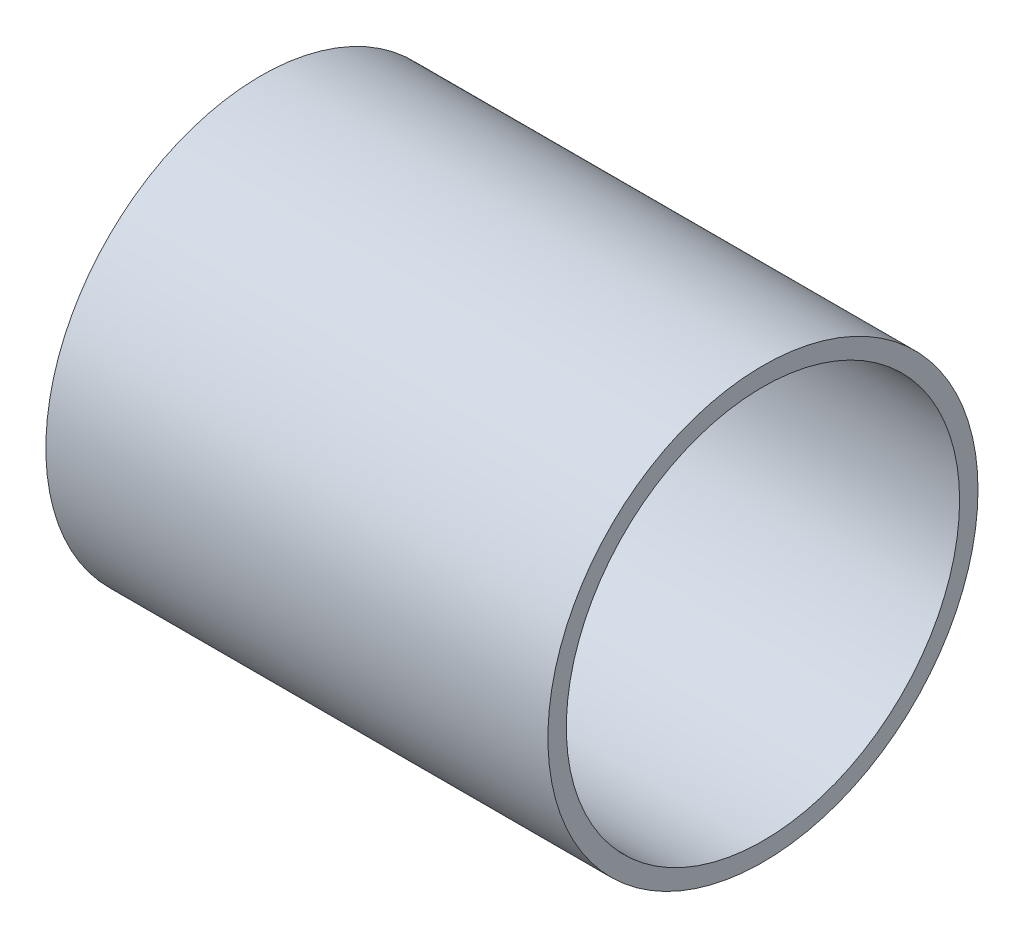
ISO-10303-21;
HEADER;
FILE_DESCRIPTION(('STEP AP214'),'2;1');
FILE_NAME('part.step','',(''),(''),'','','');
FILE_SCHEMA(('AUTOMOTIVE_DESIGN { 1 0 10303 214 1 1 1 1 }'));
ENDSEC;
DATA;
#1=APPLICATION_CONTEXT('core data for automotive mechanical design processes');
#2=APPLICATION_PROTOCOL_DEFINITION('international standard','automotive_design',2000,#1);
#3=PRODUCT_CONTEXT('',#1,'mechanical');
#4=PRODUCT('Part','Part','',(#3));
#5=PRODUCT_RELATED_PRODUCT_CATEGORY('part','',(#4));
#6=PRODUCT_DEFINITION_FORMATION('','',#4);
#7=PRODUCT_DEFINITION_CONTEXT('part definition',#1,'design');
#8=PRODUCT_DEFINITION('design','',#6,#7);
#9=PRODUCT_DEFINITION_SHAPE('','',#8);
#10=(LENGTH_UNIT() NAMED_UNIT(*) SI_UNIT(.MILLI.,.METRE.));
#11=(NAMED_UNIT(*) PLANE_ANGLE_UNIT() SI_UNIT($,.RADIAN.));
#12=(NAMED_UNIT(*) SI_UNIT($,.STERADIAN.) SOLID_ANGLE_UNIT());
#13=UNCERTAINTY_MEASURE_WITH_UNIT(LENGTH_MEASURE(1.E-05),#10,'distance_accuracy_value','');
#14=(GEOMETRIC_REPRESENTATION_CONTEXT(3) GLOBAL_UNCERTAINTY_ASSIGNED_CONTEXT((#13)) GLOBAL_UNIT_ASSIGNED_CONTEXT((#10,
#11,#12)) REPRESENTATION_CONTEXT('',''));
#15=CARTESIAN_POINT('',(0.,0.,0.));
#16=DIRECTION('',(0.,0.,1.));
#17=DIRECTION('',(1.,0.,0.));
#18=AXIS2_PLACEMENT_3D('',#15,#16,#17);
#19=CARTESIAN_POINT('',(30.,0.,0.));
#20=DIRECTION('',(1.,0.,0.));
#21=DIRECTION('',(0.,0.,-1.));
#22=AXIS2_PLACEMENT_3D('',#19,#20,#21);
#23=PLANE('',#22);
#24=CARTESIAN_POINT('',(30.,0.,0.));
#25=DIRECTION('',(1.,0.,0.));
#26=DIRECTION('',(0.,0.,-1.));
#27=AXIS2_PLACEMENT_3D('',#24,#25,#26);
#28=CIRCLE('',#27,12.85);
#29=CARTESIAN_POINT('',(30.,0.,-12.85));
#30=VERTEX_POINT('',#29);
#31=EDGE_CURVE('E10',#30,#30,#28,.T.);
#32=ORIENTED_EDGE('',*,*,#31,.T.);
#33=EDGE_LOOP('',(#32));
#34=FACE_BOUND('',#33,.T.);
#35=CARTESIAN_POINT('',(30.,0.,0.));
#36=DIRECTION('',(1.,0.,0.));
#37=DIRECTION('',(0.,0.,-1.));
#38=AXIS2_PLACEMENT_3D('',#35,#36,#37);
#39=CIRCLE('',#38,11.75);
#40=CARTESIAN_POINT('',(30.,0.,-11.75));
#41=VERTEX_POINT('',#40);
#42=EDGE_CURVE('E44',#41,#41,#39,.T.);
#43=ORIENTED_EDGE('',*,*,#42,.F.);
#44=EDGE_LOOP('',(#43));
#45=FACE_BOUND('',#44,.T.);
#46=ADVANCED_FACE('F33',(#34,#45),#23,.T.);
#47=CARTESIAN_POINT('',(0.,0.,0.));
#48=DIRECTION('',(1.,0.,0.));
#49=DIRECTION('',(0.,0.,-1.));
#50=AXIS2_PLACEMENT_3D('',#47,#48,#49);
#51=PLANE('',#50);
#52=CARTESIAN_POINT('',(0.,0.,0.));
#53=DIRECTION('',(1.,0.,0.));
#54=DIRECTION('',(0.,0.,-1.));
#55=AXIS2_PLACEMENT_3D('',#52,#53,#54);
#56=CIRCLE('',#55,12.85);
#57=CARTESIAN_POINT('',(0.,0.,-12.85));
#58=VERTEX_POINT('',#57);
#59=EDGE_CURVE('E37',#58,#58,#56,.T.);
#60=ORIENTED_EDGE('',*,*,#59,.F.);
#61=EDGE_LOOP('',(#60));
#62=FACE_BOUND('',#61,.T.);
#63=CARTESIAN_POINT('',(0.,0.,0.));
#64=DIRECTION('',(1.,0.,0.));
#65=DIRECTION('',(0.,0.,-1.));
#66=AXIS2_PLACEMENT_3D('',#63,#64,#65);
#67=CIRCLE('',#66,11.75);
#68=CARTESIAN_POINT('',(0.,0.,-11.75));
#69=VERTEX_POINT('',#68);
#70=EDGE_CURVE('E46',#69,#69,#67,.T.);
#71=ORIENTED_EDGE('',*,*,#70,.T.);
#72=EDGE_LOOP('',(#71));
#73=FACE_BOUND('',#72,.T.);
#74=ADVANCED_FACE('F56',(#62,#73),#51,.F.);
#75=CARTESIAN_POINT('',(30.,0.,0.));
#76=DIRECTION('',(-1.,0.,0.));
#77=DIRECTION('',(0.,0.,1.));
#78=AXIS2_PLACEMENT_3D('',#75,#76,#77);
#79=CYLINDRICAL_SURFACE('',#78,12.85);
#80=ORIENTED_EDGE('',*,*,#31,.F.);
#81=EDGE_LOOP('',(#80));
#82=FACE_BOUND('',#81,.T.);
#83=ORIENTED_EDGE('',*,*,#59,.T.);
#84=EDGE_LOOP('',(#83));
#85=FACE_BOUND('',#84,.T.);
#86=ADVANCED_FACE('F35',(#82,#85),#79,.T.);
#87=CARTESIAN_POINT('',(30.,0.,0.));
#88=DIRECTION('',(-1.,0.,0.));
#89=DIRECTION('',(0.,0.,1.));
#90=AXIS2_PLACEMENT_3D('',#87,#88,#89);
#91=CYLINDRICAL_SURFACE('',#90,11.75);
#92=ORIENTED_EDGE('',*,*,#42,.T.);
#93=EDGE_LOOP('',(#92));
#94=FACE_BOUND('',#93,.T.);
#95=ORIENTED_EDGE('',*,*,#70,.F.);
#96=EDGE_LOOP('',(#95));
#97=FACE_BOUND('',#96,.T.);
#98=ADVANCED_FACE('F52',(#94,#97),#91,.F.);
#99=CLOSED_SHELL('',(#46,#74,#86,#98));
#100=MANIFOLD_SOLID_BREP('B2',#99);
#101=ADVANCED_BREP_SHAPE_REPRESENTATION('',(#18,#100),#14);
#102=SHAPE_DEFINITION_REPRESENTATION(#9,#101);
ENDSEC;
END-ISO-10303-21;
